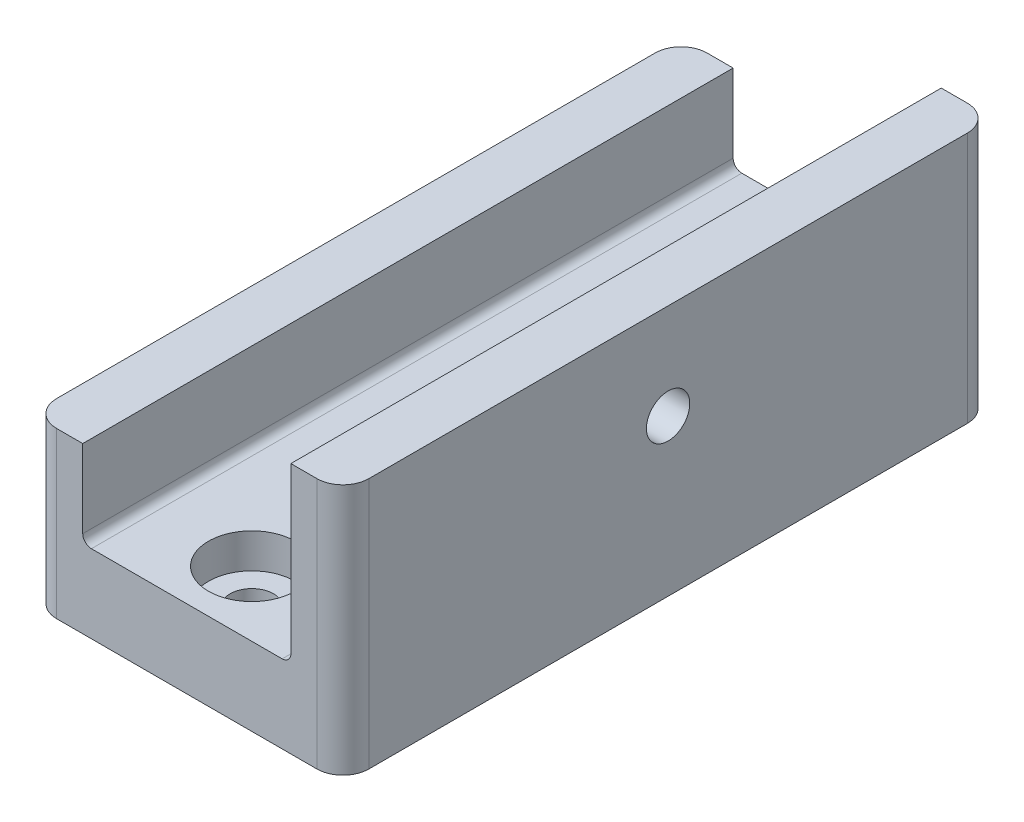
ISO-10303-21;
HEADER;
FILE_DESCRIPTION(('STEP AP214'),'2;1');
FILE_NAME('part.step','',(''),(''),'','','');
FILE_SCHEMA(('AUTOMOTIVE_DESIGN { 1 0 10303 214 1 1 1 1 }'));
ENDSEC;
DATA;
#1=APPLICATION_CONTEXT('core data for automotive mechanical design processes');
#2=APPLICATION_PROTOCOL_DEFINITION('international standard','automotive_design',2000,#1);
#3=PRODUCT_CONTEXT('',#1,'mechanical');
#4=PRODUCT('Part','Part','',(#3));
#5=PRODUCT_RELATED_PRODUCT_CATEGORY('part','',(#4));
#6=PRODUCT_DEFINITION_FORMATION('','',#4);
#7=PRODUCT_DEFINITION_CONTEXT('part definition',#1,'design');
#8=PRODUCT_DEFINITION('design','',#6,#7);
#9=PRODUCT_DEFINITION_SHAPE('','',#8);
#10=(LENGTH_UNIT() NAMED_UNIT(*) SI_UNIT(.MILLI.,.METRE.));
#11=(NAMED_UNIT(*) PLANE_ANGLE_UNIT() SI_UNIT($,.RADIAN.));
#12=(NAMED_UNIT(*) SI_UNIT($,.STERADIAN.) SOLID_ANGLE_UNIT());
#13=UNCERTAINTY_MEASURE_WITH_UNIT(LENGTH_MEASURE(1.E-05),#10,'distance_accuracy_value','');
#14=(GEOMETRIC_REPRESENTATION_CONTEXT(3) GLOBAL_UNCERTAINTY_ASSIGNED_CONTEXT((#13)) GLOBAL_UNIT_ASSIGNED_CONTEXT((#10,
#11,#12)) REPRESENTATION_CONTEXT('',''));
#15=CARTESIAN_POINT('',(0.,0.,0.));
#16=DIRECTION('',(0.,0.,1.));
#17=DIRECTION('',(1.,0.,0.));
#18=AXIS2_PLACEMENT_3D('',#15,#16,#17);
#19=CARTESIAN_POINT('',(0.,-5.5,37.5));
#20=DIRECTION('',(0.,1.,0.));
#21=DIRECTION('',(0.,0.,1.));
#22=AXIS2_PLACEMENT_3D('',#19,#20,#21);
#23=CYLINDRICAL_SURFACE('',#22,2.5);
#24=CARTESIAN_POINT('',(0.,-4.5,37.5));
#25=DIRECTION('',(0.,-1.,0.));
#26=DIRECTION('',(1.,0.,0.));
#27=AXIS2_PLACEMENT_3D('',#24,#25,#26);
#28=CIRCLE('',#27,2.5);
#29=CARTESIAN_POINT('',(2.5,-4.49999999999999,37.5));
#30=VERTEX_POINT('',#29);
#31=EDGE_CURVE('E258',#30,#30,#28,.T.);
#32=ORIENTED_EDGE('',*,*,#31,.T.);
#33=EDGE_LOOP('',(#32));
#34=FACE_BOUND('',#33,.T.);
#35=CARTESIAN_POINT('',(0.,0.5,37.5));
#36=DIRECTION('',(0.,1.,0.));
#37=DIRECTION('',(0.,0.,1.));
#38=AXIS2_PLACEMENT_3D('',#35,#36,#37);
#39=CIRCLE('',#38,2.5);
#40=CARTESIAN_POINT('',(0.,0.5,40.));
#41=VERTEX_POINT('',#40);
#42=EDGE_CURVE('E39',#41,#41,#39,.F.);
#43=ORIENTED_EDGE('',*,*,#42,.F.);
#44=EDGE_LOOP('',(#43));
#45=FACE_BOUND('',#44,.T.);
#46=ADVANCED_FACE('F35',(#34,#45),#23,.F.);
#47=CARTESIAN_POINT('',(0.,-5.5,7.5));
#48=DIRECTION('',(0.,1.,0.));
#49=DIRECTION('',(0.,0.,1.));
#50=AXIS2_PLACEMENT_3D('',#47,#48,#49);
#51=CYLINDRICAL_SURFACE('',#50,2.5);
#52=CARTESIAN_POINT('',(0.,-4.5,7.5));
#53=DIRECTION('',(0.,-1.,0.));
#54=DIRECTION('',(1.,0.,0.));
#55=AXIS2_PLACEMENT_3D('',#52,#53,#54);
#56=CIRCLE('',#55,2.5);
#57=CARTESIAN_POINT('',(2.5,-4.49999999999999,7.5));
#58=VERTEX_POINT('',#57);
#59=EDGE_CURVE('E262',#58,#58,#56,.T.);
#60=ORIENTED_EDGE('',*,*,#59,.T.);
#61=EDGE_LOOP('',(#60));
#62=FACE_BOUND('',#61,.T.);
#63=CARTESIAN_POINT('',(0.,0.5,7.5));
#64=DIRECTION('',(0.,1.,0.));
#65=DIRECTION('',(0.,0.,1.));
#66=AXIS2_PLACEMENT_3D('',#63,#64,#65);
#67=CIRCLE('',#66,2.5);
#68=CARTESIAN_POINT('',(0.,0.5,10.));
#69=VERTEX_POINT('',#68);
#70=EDGE_CURVE('E252',#69,#69,#67,.F.);
#71=ORIENTED_EDGE('',*,*,#70,.F.);
#72=EDGE_LOOP('',(#71));
#73=FACE_BOUND('',#72,.T.);
#74=ADVANCED_FACE('F295',(#62,#73),#51,.F.);
#75=CARTESIAN_POINT('',(0.,-5.5,67.5));
#76=DIRECTION('',(0.,1.,0.));
#77=DIRECTION('',(0.,0.,1.));
#78=AXIS2_PLACEMENT_3D('',#75,#76,#77);
#79=CYLINDRICAL_SURFACE('',#78,2.5);
#80=CARTESIAN_POINT('',(0.,-4.5,67.5));
#81=DIRECTION('',(0.,-1.,0.));
#82=DIRECTION('',(1.,0.,0.));
#83=AXIS2_PLACEMENT_3D('',#80,#81,#82);
#84=CIRCLE('',#83,2.5);
#85=CARTESIAN_POINT('',(2.5,-4.49999999999999,67.5));
#86=VERTEX_POINT('',#85);
#87=EDGE_CURVE('E267',#86,#86,#84,.T.);
#88=ORIENTED_EDGE('',*,*,#87,.T.);
#89=EDGE_LOOP('',(#88));
#90=FACE_BOUND('',#89,.T.);
#91=CARTESIAN_POINT('',(0.,0.5,67.5));
#92=DIRECTION('',(0.,1.,0.));
#93=DIRECTION('',(0.,0.,1.));
#94=AXIS2_PLACEMENT_3D('',#91,#92,#93);
#95=CIRCLE('',#94,2.5);
#96=CARTESIAN_POINT('',(0.,0.5,70.));
#97=VERTEX_POINT('',#96);
#98=EDGE_CURVE('E250',#97,#97,#95,.F.);
#99=ORIENTED_EDGE('',*,*,#98,.F.);
#100=EDGE_LOOP('',(#99));
#101=FACE_BOUND('',#100,.T.);
#102=ADVANCED_FACE('F300',(#90,#101),#79,.F.);
#103=CARTESIAN_POINT('',(-18.,0.,75.));
#104=DIRECTION('',(-1.,0.,0.));
#105=DIRECTION('',(0.,-1.,0.));
#106=AXIS2_PLACEMENT_3D('',#103,#104,#105);
#107=PLANE('',#106);
#108=DIRECTION('',(0.,0.,-1.));
#109=VECTOR('',#108,1.);
#110=CARTESIAN_POINT('',(-18.,14.5,75.));
#111=LINE('',#110,#109);
#112=CARTESIAN_POINT('',(-18.,14.5,72.));
#113=VERTEX_POINT('',#112);
#114=CARTESIAN_POINT('',(-18.,14.5,3.));
#115=VERTEX_POINT('',#114);
#116=EDGE_CURVE('E181',#113,#115,#111,.T.);
#117=ORIENTED_EDGE('',*,*,#116,.T.);
#118=DIRECTION('',(0.,1.,0.));
#119=VECTOR('',#118,1.);
#120=CARTESIAN_POINT('',(-18.,-4.5,3.));
#121=LINE('',#120,#119);
#122=CARTESIAN_POINT('',(-18.,-4.5,3.));
#123=VERTEX_POINT('',#122);
#124=EDGE_CURVE('E11',#115,#123,#121,.F.);
#125=ORIENTED_EDGE('',*,*,#124,.T.);
#126=DIRECTION('',(0.,0.,-1.));
#127=VECTOR('',#126,1.);
#128=CARTESIAN_POINT('',(-18.,-4.5,75.));
#129=LINE('',#128,#127);
#130=CARTESIAN_POINT('',(-18.,-4.5,72.));
#131=VERTEX_POINT('',#130);
#132=EDGE_CURVE('E202',#131,#123,#129,.T.);
#133=ORIENTED_EDGE('',*,*,#132,.F.);
#134=DIRECTION('',(0.,1.,0.));
#135=VECTOR('',#134,1.);
#136=CARTESIAN_POINT('',(-18.,0.,72.));
#137=LINE('',#136,#135);
#138=EDGE_CURVE('E44',#131,#113,#137,.T.);
#139=ORIENTED_EDGE('',*,*,#138,.T.);
#140=EDGE_LOOP('',(#117,#125,#133,#139));
#141=FACE_BOUND('',#140,.T.);
#142=ADVANCED_FACE('F358',(#141),#107,.T.);
#143=CARTESIAN_POINT('',(0.,-4.5,75.));
#144=DIRECTION('',(0.,-1.,0.));
#145=DIRECTION('',(1.,0.,0.));
#146=AXIS2_PLACEMENT_3D('',#143,#144,#145);
#147=PLANE('',#146);
#148=ORIENTED_EDGE('',*,*,#87,.F.);
#149=EDGE_LOOP('',(#148));
#150=FACE_BOUND('',#149,.T.);
#151=ORIENTED_EDGE('',*,*,#59,.F.);
#152=EDGE_LOOP('',(#151));
#153=FACE_BOUND('',#152,.T.);
#154=ORIENTED_EDGE('',*,*,#31,.F.);
#155=EDGE_LOOP('',(#154));
#156=FACE_BOUND('',#155,.T.);
#157=DIRECTION('',(-1.,0.,0.));
#158=VECTOR('',#157,1.);
#159=CARTESIAN_POINT('',(0.,-4.5,0.));
#160=LINE('',#159,#158);
#161=CARTESIAN_POINT('',(15.,-4.49999999999999,0.));
#162=VERTEX_POINT('',#161);
#163=CARTESIAN_POINT('',(-15.,-4.5,0.));
#164=VERTEX_POINT('',#163);
#165=EDGE_CURVE('E182',#162,#164,#160,.T.);
#166=ORIENTED_EDGE('',*,*,#165,.F.);
#167=CARTESIAN_POINT('',(15.,-4.49999999999999,3.));
#168=DIRECTION('',(0.,-1.,0.));
#169=DIRECTION('',(1.,0.,0.));
#170=AXIS2_PLACEMENT_3D('',#167,#168,#169);
#171=CIRCLE('',#170,3.);
#172=CARTESIAN_POINT('',(18.,-4.5,3.));
#173=VERTEX_POINT('',#172);
#174=EDGE_CURVE('E242',#162,#173,#171,.T.);
#175=ORIENTED_EDGE('',*,*,#174,.T.);
#176=DIRECTION('',(0.,0.,-1.));
#177=VECTOR('',#176,1.);
#178=CARTESIAN_POINT('',(18.,-4.5,75.));
#179=LINE('',#178,#177);
#180=CARTESIAN_POINT('',(18.,-4.5,72.));
#181=VERTEX_POINT('',#180);
#182=EDGE_CURVE('E199',#181,#173,#179,.T.);
#183=ORIENTED_EDGE('',*,*,#182,.F.);
#184=CARTESIAN_POINT('',(15.,-4.49999999999999,72.));
#185=DIRECTION('',(0.,-1.,0.));
#186=DIRECTION('',(1.,0.,0.));
#187=AXIS2_PLACEMENT_3D('',#184,#185,#186);
#188=CIRCLE('',#187,3.);
#189=CARTESIAN_POINT('',(15.,-4.49999999999999,75.));
#190=VERTEX_POINT('',#189);
#191=EDGE_CURVE('E240',#181,#190,#188,.T.);
#192=ORIENTED_EDGE('',*,*,#191,.T.);
#193=DIRECTION('',(-1.,0.,0.));
#194=VECTOR('',#193,1.);
#195=CARTESIAN_POINT('',(0.,-4.5,75.));
#196=LINE('',#195,#194);
#197=CARTESIAN_POINT('',(-15.,-4.5,75.));
#198=VERTEX_POINT('',#197);
#199=EDGE_CURVE('E167',#190,#198,#196,.T.);
#200=ORIENTED_EDGE('',*,*,#199,.T.);
#201=CARTESIAN_POINT('',(-15.,-4.5,72.));
#202=DIRECTION('',(0.,-1.,0.));
#203=DIRECTION('',(1.,0.,0.));
#204=AXIS2_PLACEMENT_3D('',#201,#202,#203);
#205=CIRCLE('',#204,3.);
#206=EDGE_CURVE('E236',#198,#131,#205,.T.);
#207=ORIENTED_EDGE('',*,*,#206,.T.);
#208=ORIENTED_EDGE('',*,*,#132,.T.);
#209=CARTESIAN_POINT('',(-15.,-4.5,3.));
#210=DIRECTION('',(0.,-1.,0.));
#211=DIRECTION('',(1.,0.,0.));
#212=AXIS2_PLACEMENT_3D('',#209,#210,#211);
#213=CIRCLE('',#212,3.);
#214=EDGE_CURVE('E238',#123,#164,#213,.T.);
#215=ORIENTED_EDGE('',*,*,#214,.T.);
#216=EDGE_LOOP('',(#166,#175,#183,#192,#200,#207,#208,#215));
#217=FACE_BOUND('',#216,.T.);
#218=ADVANCED_FACE('F347',(#150,#153,#156,#217),#147,.T.);
#219=CARTESIAN_POINT('',(18.,0.,75.));
#220=DIRECTION('',(-1.,0.,0.));
#221=DIRECTION('',(0.,0.,1.));
#222=AXIS2_PLACEMENT_3D('',#219,#220,#221);
#223=PLANE('',#222);
#224=CARTESIAN_POINT('',(18.,13.5,37.5));
#225=DIRECTION('',(-1.,0.,0.));
#226=DIRECTION('',(0.,0.,1.));
#227=AXIS2_PLACEMENT_3D('',#224,#225,#226);
#228=CIRCLE('',#227,2.5);
#229=CARTESIAN_POINT('',(18.,13.5,40.));
#230=VERTEX_POINT('',#229);
#231=EDGE_CURVE('E185',#230,#230,#228,.T.);
#232=ORIENTED_EDGE('',*,*,#231,.T.);
#233=EDGE_LOOP('',(#232));
#234=FACE_BOUND('',#233,.T.);
#235=ORIENTED_EDGE('',*,*,#182,.T.);
#236=DIRECTION('',(0.,1.,0.));
#237=VECTOR('',#236,1.);
#238=CARTESIAN_POINT('',(18.,0.,3.));
#239=LINE('',#238,#237);
#240=CARTESIAN_POINT('',(18.,24.5,3.));
#241=VERTEX_POINT('',#240);
#242=EDGE_CURVE('E224',#173,#241,#239,.T.);
#243=ORIENTED_EDGE('',*,*,#242,.T.);
#244=DIRECTION('',(0.,0.,-1.));
#245=VECTOR('',#244,1.);
#246=CARTESIAN_POINT('',(18.,24.5,75.));
#247=LINE('',#246,#245);
#248=CARTESIAN_POINT('',(18.,24.5,72.));
#249=VERTEX_POINT('',#248);
#250=EDGE_CURVE('E159',#249,#241,#247,.T.);
#251=ORIENTED_EDGE('',*,*,#250,.F.);
#252=DIRECTION('',(0.,1.,0.));
#253=VECTOR('',#252,1.);
#254=CARTESIAN_POINT('',(18.,-4.5,72.));
#255=LINE('',#254,#253);
#256=EDGE_CURVE('E222',#249,#181,#255,.F.);
#257=ORIENTED_EDGE('',*,*,#256,.T.);
#258=EDGE_LOOP('',(#235,#243,#251,#257));
#259=FACE_BOUND('',#258,.T.);
#260=ADVANCED_FACE('F292',(#234,#259),#223,.F.);
#261=CARTESIAN_POINT('',(0.,24.5,75.));
#262=DIRECTION('',(0.,1.,0.));
#263=DIRECTION('',(0.,0.,1.));
#264=AXIS2_PLACEMENT_3D('',#261,#262,#263);
#265=PLANE('',#264);
#266=ORIENTED_EDGE('',*,*,#250,.T.);
#267=CARTESIAN_POINT('',(15.,24.5,3.));
#268=DIRECTION('',(0.,1.,0.));
#269=DIRECTION('',(0.,0.,1.));
#270=AXIS2_PLACEMENT_3D('',#267,#268,#269);
#271=CIRCLE('',#270,3.);
#272=CARTESIAN_POINT('',(15.,24.5,0.));
#273=VERTEX_POINT('',#272);
#274=EDGE_CURVE('E229',#241,#273,#271,.T.);
#275=ORIENTED_EDGE('',*,*,#274,.T.);
#276=DIRECTION('',(1.,0.,0.));
#277=VECTOR('',#276,1.);
#278=CARTESIAN_POINT('',(0.,24.5,0.));
#279=LINE('',#278,#277);
#280=CARTESIAN_POINT('',(12.,24.5,0.));
#281=VERTEX_POINT('',#280);
#282=EDGE_CURVE('E158',#281,#273,#279,.T.);
#283=ORIENTED_EDGE('',*,*,#282,.F.);
#284=DIRECTION('',(0.,0.,-1.));
#285=VECTOR('',#284,1.);
#286=CARTESIAN_POINT('',(12.,24.5,75.));
#287=LINE('',#286,#285);
#288=CARTESIAN_POINT('',(12.,24.5,75.));
#289=VERTEX_POINT('',#288);
#290=EDGE_CURVE('E143',#289,#281,#287,.T.);
#291=ORIENTED_EDGE('',*,*,#290,.F.);
#292=DIRECTION('',(1.,0.,0.));
#293=VECTOR('',#292,1.);
#294=CARTESIAN_POINT('',(0.,24.5,75.));
#295=LINE('',#294,#293);
#296=CARTESIAN_POINT('',(15.,24.5,75.));
#297=VERTEX_POINT('',#296);
#298=EDGE_CURVE('E151',#289,#297,#295,.T.);
#299=ORIENTED_EDGE('',*,*,#298,.T.);
#300=CARTESIAN_POINT('',(15.,24.5,72.));
#301=DIRECTION('',(0.,1.,0.));
#302=DIRECTION('',(0.,0.,1.));
#303=AXIS2_PLACEMENT_3D('',#300,#301,#302);
#304=CIRCLE('',#303,3.);
#305=EDGE_CURVE('E227',#297,#249,#304,.T.);
#306=ORIENTED_EDGE('',*,*,#305,.T.);
#307=EDGE_LOOP('',(#266,#275,#283,#291,#299,#306));
#308=FACE_BOUND('',#307,.T.);
#309=ADVANCED_FACE('F156',(#308),#265,.T.);
#310=CARTESIAN_POINT('',(12.,0.,75.));
#311=DIRECTION('',(-1.,0.,0.));
#312=DIRECTION('',(0.,0.,1.));
#313=AXIS2_PLACEMENT_3D('',#310,#311,#312);
#314=PLANE('',#313);
#315=CARTESIAN_POINT('',(12.,13.5,37.5));
#316=DIRECTION('',(-1.,0.,0.));
#317=DIRECTION('',(0.,0.,1.));
#318=AXIS2_PLACEMENT_3D('',#315,#316,#317);
#319=CIRCLE('',#318,2.5);
#320=CARTESIAN_POINT('',(12.,13.5,40.));
#321=VERTEX_POINT('',#320);
#322=EDGE_CURVE('E275',#321,#321,#319,.T.);
#323=ORIENTED_EDGE('',*,*,#322,.F.);
#324=EDGE_LOOP('',(#323));
#325=FACE_BOUND('',#324,.T.);
#326=DIRECTION('',(0.,1.,0.));
#327=VECTOR('',#326,1.);
#328=CARTESIAN_POINT('',(12.,0.,0.));
#329=LINE('',#328,#327);
#330=CARTESIAN_POINT('',(12.,5.5,0.));
#331=VERTEX_POINT('',#330);
#332=EDGE_CURVE('E187',#331,#281,#329,.T.);
#333=ORIENTED_EDGE('',*,*,#332,.F.);
#334=DIRECTION('',(0.,0.,-1.));
#335=VECTOR('',#334,1.);
#336=CARTESIAN_POINT('',(12.,5.5,75.));
#337=LINE('',#336,#335);
#338=CARTESIAN_POINT('',(12.,5.5,75.));
#339=VERTEX_POINT('',#338);
#340=EDGE_CURVE('E146',#331,#339,#337,.F.);
#341=ORIENTED_EDGE('',*,*,#340,.T.);
#342=DIRECTION('',(0.,1.,0.));
#343=VECTOR('',#342,1.);
#344=CARTESIAN_POINT('',(12.,0.,75.));
#345=LINE('',#344,#343);
#346=EDGE_CURVE('E139',#339,#289,#345,.T.);
#347=ORIENTED_EDGE('',*,*,#346,.T.);
#348=ORIENTED_EDGE('',*,*,#290,.T.);
#349=EDGE_LOOP('',(#333,#341,#347,#348));
#350=FACE_BOUND('',#349,.T.);
#351=ADVANCED_FACE('F142',(#325,#350),#314,.T.);
#352=CARTESIAN_POINT('',(0.,4.5,75.));
#353=DIRECTION('',(0.,-1.,0.));
#354=DIRECTION('',(0.,0.,-1.));
#355=AXIS2_PLACEMENT_3D('',#352,#353,#354);
#356=PLANE('',#355);
#357=CARTESIAN_POINT('',(0.,4.5,7.5));
#358=DIRECTION('',(0.,1.,0.));
#359=DIRECTION('',(0.,0.,1.));
#360=AXIS2_PLACEMENT_3D('',#357,#358,#359);
#361=CIRCLE('',#360,5.);
#362=CARTESIAN_POINT('',(0.,4.5,12.5));
#363=VERTEX_POINT('',#362);
#364=EDGE_CURVE('E594',#363,#363,#361,.T.);
#365=ORIENTED_EDGE('',*,*,#364,.F.);
#366=EDGE_LOOP('',(#365));
#367=FACE_BOUND('',#366,.T.);
#368=CARTESIAN_POINT('',(0.,4.5,37.5));
#369=DIRECTION('',(0.,1.,0.));
#370=DIRECTION('',(0.,0.,1.));
#371=AXIS2_PLACEMENT_3D('',#368,#369,#370);
#372=CIRCLE('',#371,5.);
#373=CARTESIAN_POINT('',(0.,4.5,42.5));
#374=VERTEX_POINT('',#373);
#375=EDGE_CURVE('E590',#374,#374,#372,.T.);
#376=ORIENTED_EDGE('',*,*,#375,.F.);
#377=EDGE_LOOP('',(#376));
#378=FACE_BOUND('',#377,.T.);
#379=CARTESIAN_POINT('',(0.,4.5,67.5));
#380=DIRECTION('',(0.,1.,0.));
#381=DIRECTION('',(0.,0.,1.));
#382=AXIS2_PLACEMENT_3D('',#379,#380,#381);
#383=CIRCLE('',#382,5.);
#384=CARTESIAN_POINT('',(0.,4.5,72.5));
#385=VERTEX_POINT('',#384);
#386=EDGE_CURVE('E270',#385,#385,#383,.T.);
#387=ORIENTED_EDGE('',*,*,#386,.F.);
#388=EDGE_LOOP('',(#387));
#389=FACE_BOUND('',#388,.T.);
#390=DIRECTION('',(-1.,0.,0.));
#391=VECTOR('',#390,1.);
#392=CARTESIAN_POINT('',(0.,4.5,75.));
#393=LINE('',#392,#391);
#394=CARTESIAN_POINT('',(11.,4.5,75.));
#395=VERTEX_POINT('',#394);
#396=CARTESIAN_POINT('',(-11.,4.5,75.));
#397=VERTEX_POINT('',#396);
#398=EDGE_CURVE('E150',#395,#397,#393,.T.);
#399=ORIENTED_EDGE('',*,*,#398,.F.);
#400=DIRECTION('',(0.,0.,-1.));
#401=VECTOR('',#400,1.);
#402=CARTESIAN_POINT('',(11.,4.5,75.));
#403=LINE('',#402,#401);
#404=CARTESIAN_POINT('',(11.,4.5,0.));
#405=VERTEX_POINT('',#404);
#406=EDGE_CURVE('E207',#395,#405,#403,.T.);
#407=ORIENTED_EDGE('',*,*,#406,.T.);
#408=DIRECTION('',(-1.,0.,0.));
#409=VECTOR('',#408,1.);
#410=CARTESIAN_POINT('',(0.,4.5,0.));
#411=LINE('',#410,#409);
#412=CARTESIAN_POINT('',(-11.,4.5,0.));
#413=VERTEX_POINT('',#412);
#414=EDGE_CURVE('E189',#405,#413,#411,.T.);
#415=ORIENTED_EDGE('',*,*,#414,.T.);
#416=DIRECTION('',(0.,0.,-1.));
#417=VECTOR('',#416,1.);
#418=CARTESIAN_POINT('',(-11.,4.5,75.));
#419=LINE('',#418,#417);
#420=EDGE_CURVE('E205',#413,#397,#419,.F.);
#421=ORIENTED_EDGE('',*,*,#420,.T.);
#422=EDGE_LOOP('',(#399,#407,#415,#421));
#423=FACE_BOUND('',#422,.T.);
#424=ADVANCED_FACE('F283',(#367,#378,#389,#423),#356,.F.);
#425=CARTESIAN_POINT('',(-12.,0.,75.));
#426=DIRECTION('',(-1.,0.,0.));
#427=DIRECTION('',(0.,0.,1.));
#428=AXIS2_PLACEMENT_3D('',#425,#426,#427);
#429=PLANE('',#428);
#430=DIRECTION('',(0.,1.,0.));
#431=VECTOR('',#430,1.);
#432=CARTESIAN_POINT('',(-12.,0.,75.));
#433=LINE('',#432,#431);
#434=CARTESIAN_POINT('',(-12.,5.5,75.));
#435=VERTEX_POINT('',#434);
#436=CARTESIAN_POINT('',(-12.,14.5,75.));
#437=VERTEX_POINT('',#436);
#438=EDGE_CURVE('E176',#435,#437,#433,.T.);
#439=ORIENTED_EDGE('',*,*,#438,.F.);
#440=DIRECTION('',(0.,0.,-1.));
#441=VECTOR('',#440,1.);
#442=CARTESIAN_POINT('',(-12.,5.5,0.));
#443=LINE('',#442,#441);
#444=CARTESIAN_POINT('',(-12.,5.5,0.));
#445=VERTEX_POINT('',#444);
#446=EDGE_CURVE('E211',#435,#445,#443,.T.);
#447=ORIENTED_EDGE('',*,*,#446,.T.);
#448=DIRECTION('',(0.,1.,0.));
#449=VECTOR('',#448,1.);
#450=CARTESIAN_POINT('',(-12.,0.,0.));
#451=LINE('',#450,#449);
#452=CARTESIAN_POINT('',(-12.,14.5,0.));
#453=VERTEX_POINT('',#452);
#454=EDGE_CURVE('E192',#445,#453,#451,.T.);
#455=ORIENTED_EDGE('',*,*,#454,.T.);
#456=DIRECTION('',(0.,0.,-1.));
#457=VECTOR('',#456,1.);
#458=CARTESIAN_POINT('',(-12.,14.5,75.));
#459=LINE('',#458,#457);
#460=EDGE_CURVE('E160',#437,#453,#459,.T.);
#461=ORIENTED_EDGE('',*,*,#460,.F.);
#462=EDGE_LOOP('',(#439,#447,#455,#461));
#463=FACE_BOUND('',#462,.T.);
#464=ADVANCED_FACE('F289',(#463),#429,.F.);
#465=CARTESIAN_POINT('',(0.,14.5,75.));
#466=DIRECTION('',(0.,-1.,0.));
#467=DIRECTION('',(0.,0.,-1.));
#468=AXIS2_PLACEMENT_3D('',#465,#466,#467);
#469=PLANE('',#468);
#470=DIRECTION('',(-1.,0.,0.));
#471=VECTOR('',#470,1.);
#472=CARTESIAN_POINT('',(0.,14.5,0.));
#473=LINE('',#472,#471);
#474=CARTESIAN_POINT('',(-15.,14.5,0.));
#475=VERTEX_POINT('',#474);
#476=EDGE_CURVE('E170',#453,#475,#473,.T.);
#477=ORIENTED_EDGE('',*,*,#476,.T.);
#478=CARTESIAN_POINT('',(-15.,14.5,3.));
#479=DIRECTION('',(0.,-1.,0.));
#480=DIRECTION('',(0.,0.,-1.));
#481=AXIS2_PLACEMENT_3D('',#478,#479,#480);
#482=CIRCLE('',#481,3.);
#483=EDGE_CURVE('E52',#475,#115,#482,.F.);
#484=ORIENTED_EDGE('',*,*,#483,.T.);
#485=ORIENTED_EDGE('',*,*,#116,.F.);
#486=CARTESIAN_POINT('',(-15.,14.5,72.));
#487=DIRECTION('',(0.,-1.,0.));
#488=DIRECTION('',(0.,0.,-1.));
#489=AXIS2_PLACEMENT_3D('',#486,#487,#488);
#490=CIRCLE('',#489,3.);
#491=CARTESIAN_POINT('',(-15.,14.5,75.));
#492=VERTEX_POINT('',#491);
#493=EDGE_CURVE('E60',#113,#492,#490,.F.);
#494=ORIENTED_EDGE('',*,*,#493,.T.);
#495=DIRECTION('',(-1.,0.,0.));
#496=VECTOR('',#495,1.);
#497=CARTESIAN_POINT('',(0.,14.5,75.));
#498=LINE('',#497,#496);
#499=EDGE_CURVE('E178',#437,#492,#498,.T.);
#500=ORIENTED_EDGE('',*,*,#499,.F.);
#501=ORIENTED_EDGE('',*,*,#460,.T.);
#502=EDGE_LOOP('',(#477,#484,#485,#494,#500,#501));
#503=FACE_BOUND('',#502,.T.);
#504=ADVANCED_FACE('F313',(#503),#469,.F.);
#505=CARTESIAN_POINT('',(0.,0.,75.));
#506=DIRECTION('',(0.,0.,1.));
#507=DIRECTION('',(1.,0.,0.));
#508=AXIS2_PLACEMENT_3D('',#505,#506,#507);
#509=PLANE('',#508);
#510=ORIENTED_EDGE('',*,*,#199,.F.);
#511=DIRECTION('',(0.,1.,0.));
#512=VECTOR('',#511,1.);
#513=CARTESIAN_POINT('',(15.,24.5,75.));
#514=LINE('',#513,#512);
#515=EDGE_CURVE('E166',#190,#297,#514,.T.);
#516=ORIENTED_EDGE('',*,*,#515,.T.);
#517=ORIENTED_EDGE('',*,*,#298,.F.);
#518=ORIENTED_EDGE('',*,*,#346,.F.);
#519=CARTESIAN_POINT('',(11.,5.5,75.));
#520=DIRECTION('',(0.,0.,1.));
#521=DIRECTION('',(1.,0.,0.));
#522=AXIS2_PLACEMENT_3D('',#519,#520,#521);
#523=CIRCLE('',#522,1.);
#524=EDGE_CURVE('E216',#339,#395,#523,.F.);
#525=ORIENTED_EDGE('',*,*,#524,.T.);
#526=ORIENTED_EDGE('',*,*,#398,.T.);
#527=CARTESIAN_POINT('',(-11.,5.5,75.));
#528=DIRECTION('',(0.,0.,1.));
#529=DIRECTION('',(1.,0.,0.));
#530=AXIS2_PLACEMENT_3D('',#527,#528,#529);
#531=CIRCLE('',#530,1.);
#532=EDGE_CURVE('E220',#397,#435,#531,.F.);
#533=ORIENTED_EDGE('',*,*,#532,.T.);
#534=ORIENTED_EDGE('',*,*,#438,.T.);
#535=ORIENTED_EDGE('',*,*,#499,.T.);
#536=DIRECTION('',(0.,1.,0.));
#537=VECTOR('',#536,1.);
#538=CARTESIAN_POINT('',(-15.,0.,75.));
#539=LINE('',#538,#537);
#540=EDGE_CURVE('E244',#492,#198,#539,.F.);
#541=ORIENTED_EDGE('',*,*,#540,.T.);
#542=EDGE_LOOP('',(#510,#516,#517,#518,#525,#526,#533,#534,#535,#541));
#543=FACE_BOUND('',#542,.T.);
#544=ADVANCED_FACE('F164',(#543),#509,.T.);
#545=CARTESIAN_POINT('',(0.,0.,0.));
#546=DIRECTION('',(0.,0.,1.));
#547=DIRECTION('',(1.,0.,0.));
#548=AXIS2_PLACEMENT_3D('',#545,#546,#547);
#549=PLANE('',#548);
#550=ORIENTED_EDGE('',*,*,#282,.T.);
#551=DIRECTION('',(0.,1.,0.));
#552=VECTOR('',#551,1.);
#553=CARTESIAN_POINT('',(15.,0.,0.));
#554=LINE('',#553,#552);
#555=EDGE_CURVE('E234',#273,#162,#554,.F.);
#556=ORIENTED_EDGE('',*,*,#555,.T.);
#557=ORIENTED_EDGE('',*,*,#165,.T.);
#558=DIRECTION('',(0.,1.,0.));
#559=VECTOR('',#558,1.);
#560=CARTESIAN_POINT('',(-15.,14.5,0.));
#561=LINE('',#560,#559);
#562=EDGE_CURVE('E231',#164,#475,#561,.T.);
#563=ORIENTED_EDGE('',*,*,#562,.T.);
#564=ORIENTED_EDGE('',*,*,#476,.F.);
#565=ORIENTED_EDGE('',*,*,#454,.F.);
#566=CARTESIAN_POINT('',(-11.,5.5,0.));
#567=DIRECTION('',(0.,0.,1.));
#568=DIRECTION('',(1.,0.,0.));
#569=AXIS2_PLACEMENT_3D('',#566,#567,#568);
#570=CIRCLE('',#569,1.);
#571=EDGE_CURVE('E218',#445,#413,#570,.T.);
#572=ORIENTED_EDGE('',*,*,#571,.T.);
#573=ORIENTED_EDGE('',*,*,#414,.F.);
#574=CARTESIAN_POINT('',(11.,5.5,0.));
#575=DIRECTION('',(0.,0.,1.));
#576=DIRECTION('',(1.,0.,0.));
#577=AXIS2_PLACEMENT_3D('',#574,#575,#576);
#578=CIRCLE('',#577,1.);
#579=EDGE_CURVE('E214',#405,#331,#578,.T.);
#580=ORIENTED_EDGE('',*,*,#579,.T.);
#581=ORIENTED_EDGE('',*,*,#332,.T.);
#582=EDGE_LOOP('',(#550,#556,#557,#563,#564,#565,#572,#573,#580,#581));
#583=FACE_BOUND('',#582,.T.);
#584=ADVANCED_FACE('F312',(#583),#549,.F.);
#585=CARTESIAN_POINT('',(11.,5.5,75.));
#586=DIRECTION('',(0.,0.,-1.));
#587=DIRECTION('',(-1.,0.,0.));
#588=AXIS2_PLACEMENT_3D('',#585,#586,#587);
#589=CYLINDRICAL_SURFACE('',#588,1.);
#590=ORIENTED_EDGE('',*,*,#524,.F.);
#591=ORIENTED_EDGE('',*,*,#340,.F.);
#592=ORIENTED_EDGE('',*,*,#579,.F.);
#593=ORIENTED_EDGE('',*,*,#406,.F.);
#594=EDGE_LOOP('',(#590,#591,#592,#593));
#595=FACE_BOUND('',#594,.T.);
#596=ADVANCED_FACE('F316',(#595),#589,.F.);
#597=CARTESIAN_POINT('',(-11.,5.5,75.));
#598=DIRECTION('',(0.,0.,1.));
#599=DIRECTION('',(1.,0.,0.));
#600=AXIS2_PLACEMENT_3D('',#597,#598,#599);
#601=CYLINDRICAL_SURFACE('',#600,1.);
#602=ORIENTED_EDGE('',*,*,#532,.F.);
#603=ORIENTED_EDGE('',*,*,#420,.F.);
#604=ORIENTED_EDGE('',*,*,#571,.F.);
#605=ORIENTED_EDGE('',*,*,#446,.F.);
#606=EDGE_LOOP('',(#602,#603,#604,#605));
#607=FACE_BOUND('',#606,.T.);
#608=ADVANCED_FACE('F331',(#607),#601,.F.);
#609=CARTESIAN_POINT('',(15.,0.,3.));
#610=DIRECTION('',(0.,1.,0.));
#611=DIRECTION('',(0.,0.,1.));
#612=AXIS2_PLACEMENT_3D('',#609,#610,#611);
#613=CYLINDRICAL_SURFACE('',#612,3.);
#614=ORIENTED_EDGE('',*,*,#174,.F.);
#615=ORIENTED_EDGE('',*,*,#555,.F.);
#616=ORIENTED_EDGE('',*,*,#274,.F.);
#617=ORIENTED_EDGE('',*,*,#242,.F.);
#618=EDGE_LOOP('',(#614,#615,#616,#617));
#619=FACE_BOUND('',#618,.T.);
#620=ADVANCED_FACE('F343',(#619),#613,.T.);
#621=CARTESIAN_POINT('',(15.,0.,72.));
#622=DIRECTION('',(0.,-1.,0.));
#623=DIRECTION('',(0.,0.,-1.));
#624=AXIS2_PLACEMENT_3D('',#621,#622,#623);
#625=CYLINDRICAL_SURFACE('',#624,3.);
#626=ORIENTED_EDGE('',*,*,#191,.F.);
#627=ORIENTED_EDGE('',*,*,#256,.F.);
#628=ORIENTED_EDGE('',*,*,#305,.F.);
#629=ORIENTED_EDGE('',*,*,#515,.F.);
#630=EDGE_LOOP('',(#626,#627,#628,#629));
#631=FACE_BOUND('',#630,.T.);
#632=ADVANCED_FACE('F353',(#631),#625,.T.);
#633=CARTESIAN_POINT('',(-15.,0.,3.));
#634=DIRECTION('',(0.,-1.,0.));
#635=DIRECTION('',(1.,0.,0.));
#636=AXIS2_PLACEMENT_3D('',#633,#634,#635);
#637=CYLINDRICAL_SURFACE('',#636,3.);
#638=ORIENTED_EDGE('',*,*,#214,.F.);
#639=ORIENTED_EDGE('',*,*,#124,.F.);
#640=ORIENTED_EDGE('',*,*,#483,.F.);
#641=ORIENTED_EDGE('',*,*,#562,.F.);
#642=EDGE_LOOP('',(#638,#639,#640,#641));
#643=FACE_BOUND('',#642,.T.);
#644=ADVANCED_FACE('F361',(#643),#637,.T.);
#645=CARTESIAN_POINT('',(-15.,0.,72.));
#646=DIRECTION('',(0.,1.,0.));
#647=DIRECTION('',(-1.,0.,0.));
#648=AXIS2_PLACEMENT_3D('',#645,#646,#647);
#649=CYLINDRICAL_SURFACE('',#648,3.);
#650=ORIENTED_EDGE('',*,*,#206,.F.);
#651=ORIENTED_EDGE('',*,*,#540,.F.);
#652=ORIENTED_EDGE('',*,*,#493,.F.);
#653=ORIENTED_EDGE('',*,*,#138,.F.);
#654=EDGE_LOOP('',(#650,#651,#652,#653));
#655=FACE_BOUND('',#654,.T.);
#656=ADVANCED_FACE('F37',(#655),#649,.T.);
#657=CARTESIAN_POINT('',(18.,13.5,37.5));
#658=DIRECTION('',(-1.,0.,0.));
#659=DIRECTION('',(0.,0.,1.));
#660=AXIS2_PLACEMENT_3D('',#657,#658,#659);
#661=CYLINDRICAL_SURFACE('',#660,2.5);
#662=ORIENTED_EDGE('',*,*,#231,.F.);
#663=EDGE_LOOP('',(#662));
#664=FACE_BOUND('',#663,.T.);
#665=ORIENTED_EDGE('',*,*,#322,.T.);
#666=EDGE_LOOP('',(#665));
#667=FACE_BOUND('',#666,.T.);
#668=ADVANCED_FACE('F280',(#664,#667),#661,.F.);
#669=CARTESIAN_POINT('',(0.,0.5,67.5));
#670=DIRECTION('',(0.,1.,0.));
#671=DIRECTION('',(0.,0.,1.));
#672=AXIS2_PLACEMENT_3D('',#669,#670,#671);
#673=PLANE('',#672);
#674=CARTESIAN_POINT('',(0.,0.5,67.5));
#675=DIRECTION('',(0.,1.,0.));
#676=DIRECTION('',(0.,0.,1.));
#677=AXIS2_PLACEMENT_3D('',#674,#675,#676);
#678=CIRCLE('',#677,5.);
#679=CARTESIAN_POINT('',(0.,0.5,72.5));
#680=VERTEX_POINT('',#679);
#681=EDGE_CURVE('E592',#680,#680,#678,.T.);
#682=ORIENTED_EDGE('',*,*,#681,.T.);
#683=EDGE_LOOP('',(#682));
#684=FACE_BOUND('',#683,.T.);
#685=ORIENTED_EDGE('',*,*,#98,.T.);
#686=EDGE_LOOP('',(#685));
#687=FACE_BOUND('',#686,.T.);
#688=ADVANCED_FACE('F308',(#684,#687),#673,.T.);
#689=CARTESIAN_POINT('',(0.,0.5,67.5));
#690=DIRECTION('',(0.,1.,0.));
#691=DIRECTION('',(0.,0.,1.));
#692=AXIS2_PLACEMENT_3D('',#689,#690,#691);
#693=CYLINDRICAL_SURFACE('',#692,5.);
#694=ORIENTED_EDGE('',*,*,#681,.F.);
#695=EDGE_LOOP('',(#694));
#696=FACE_BOUND('',#695,.T.);
#697=ORIENTED_EDGE('',*,*,#386,.T.);
#698=EDGE_LOOP('',(#697));
#699=FACE_BOUND('',#698,.T.);
#700=ADVANCED_FACE('F456',(#696,#699),#693,.F.);
#701=CARTESIAN_POINT('',(0.,0.5,7.5));
#702=DIRECTION('',(0.,1.,0.));
#703=DIRECTION('',(0.,0.,1.));
#704=AXIS2_PLACEMENT_3D('',#701,#702,#703);
#705=PLANE('',#704);
#706=CARTESIAN_POINT('',(0.,0.5,7.5));
#707=DIRECTION('',(0.,1.,0.));
#708=DIRECTION('',(0.,0.,1.));
#709=AXIS2_PLACEMENT_3D('',#706,#707,#708);
#710=CIRCLE('',#709,5.);
#711=CARTESIAN_POINT('',(0.,0.5,12.5));
#712=VERTEX_POINT('',#711);
#713=EDGE_CURVE('E253',#712,#712,#710,.T.);
#714=ORIENTED_EDGE('',*,*,#713,.T.);
#715=EDGE_LOOP('',(#714));
#716=FACE_BOUND('',#715,.T.);
#717=ORIENTED_EDGE('',*,*,#70,.T.);
#718=EDGE_LOOP('',(#717));
#719=FACE_BOUND('',#718,.T.);
#720=ADVANCED_FACE('F465',(#716,#719),#705,.T.);
#721=CARTESIAN_POINT('',(0.,0.5,7.5));
#722=DIRECTION('',(0.,1.,0.));
#723=DIRECTION('',(0.,0.,1.));
#724=AXIS2_PLACEMENT_3D('',#721,#722,#723);
#725=CYLINDRICAL_SURFACE('',#724,5.);
#726=ORIENTED_EDGE('',*,*,#713,.F.);
#727=EDGE_LOOP('',(#726));
#728=FACE_BOUND('',#727,.T.);
#729=ORIENTED_EDGE('',*,*,#364,.T.);
#730=EDGE_LOOP('',(#729));
#731=FACE_BOUND('',#730,.T.);
#732=ADVANCED_FACE('F473',(#728,#731),#725,.F.);
#733=CARTESIAN_POINT('',(0.,0.5,37.5));
#734=DIRECTION('',(0.,1.,0.));
#735=DIRECTION('',(0.,0.,1.));
#736=AXIS2_PLACEMENT_3D('',#733,#734,#735);
#737=PLANE('',#736);
#738=CARTESIAN_POINT('',(0.,0.5,37.5));
#739=DIRECTION('',(0.,1.,0.));
#740=DIRECTION('',(0.,0.,1.));
#741=AXIS2_PLACEMENT_3D('',#738,#739,#740);
#742=CIRCLE('',#741,5.);
#743=CARTESIAN_POINT('',(0.,0.5,42.5));
#744=VERTEX_POINT('',#743);
#745=EDGE_CURVE('E587',#744,#744,#742,.T.);
#746=ORIENTED_EDGE('',*,*,#745,.T.);
#747=EDGE_LOOP('',(#746));
#748=FACE_BOUND('',#747,.T.);
#749=ORIENTED_EDGE('',*,*,#42,.T.);
#750=EDGE_LOOP('',(#749));
#751=FACE_BOUND('',#750,.T.);
#752=ADVANCED_FACE('F481',(#748,#751),#737,.T.);
#753=CARTESIAN_POINT('',(0.,0.5,37.5));
#754=DIRECTION('',(0.,1.,0.));
#755=DIRECTION('',(0.,0.,1.));
#756=AXIS2_PLACEMENT_3D('',#753,#754,#755);
#757=CYLINDRICAL_SURFACE('',#756,5.);
#758=ORIENTED_EDGE('',*,*,#745,.F.);
#759=EDGE_LOOP('',(#758));
#760=FACE_BOUND('',#759,.T.);
#761=ORIENTED_EDGE('',*,*,#375,.T.);
#762=EDGE_LOOP('',(#761));
#763=FACE_BOUND('',#762,.T.);
#764=ADVANCED_FACE('F489',(#760,#763),#757,.F.);
#765=CLOSED_SHELL('',(#46,#74,#102,#142,#218,#260,#309,#351,#424,#464,#504,#544,#584,#596,#608,
#620,#632,#644,#656,#668,#688,#700,#720,#732,#752,#764));
#766=MANIFOLD_SOLID_BREP('B2',#765);
#767=ADVANCED_BREP_SHAPE_REPRESENTATION('',(#18,#766),#14);
#768=SHAPE_DEFINITION_REPRESENTATION(#9,#767);
ENDSEC;
END-ISO-10303-21;
